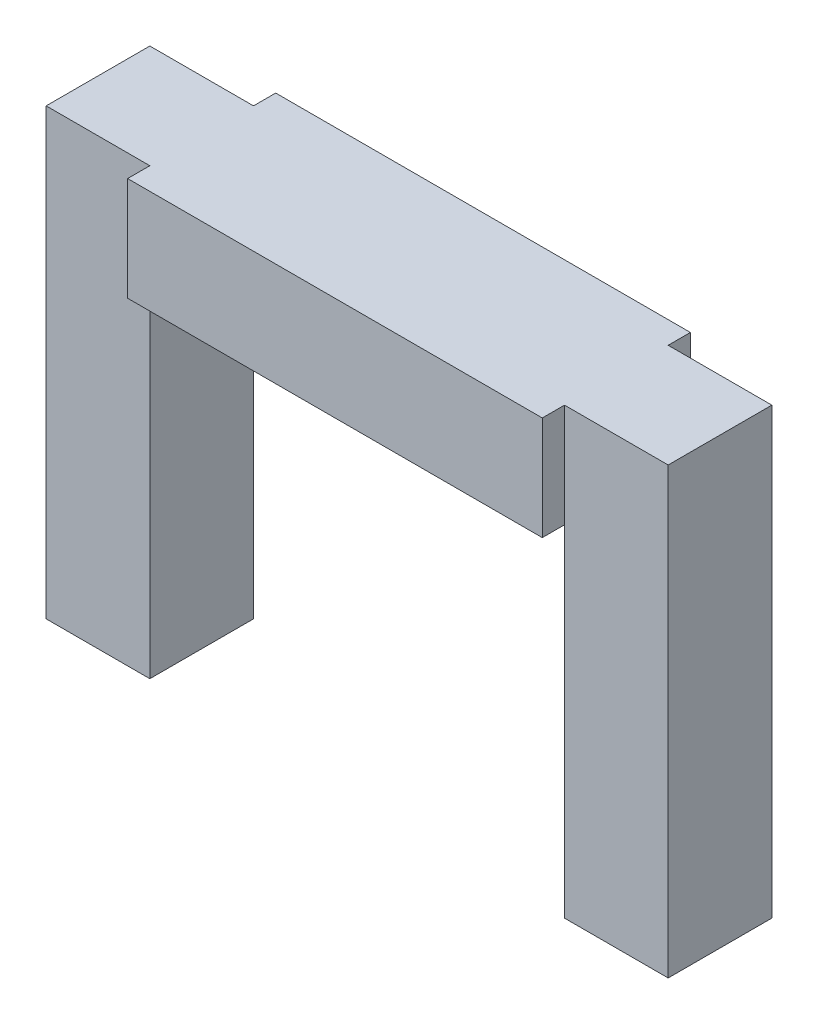
ISO-10303-21;
HEADER;
FILE_DESCRIPTION(('STEP AP214'),'2;1');
FILE_NAME('part.step','',(''),(''),'','','');
FILE_SCHEMA(('AUTOMOTIVE_DESIGN { 1 0 10303 214 1 1 1 1 }'));
ENDSEC;
DATA;
#1=APPLICATION_CONTEXT('core data for automotive mechanical design processes');
#2=APPLICATION_PROTOCOL_DEFINITION('international standard','automotive_design',2000,#1);
#3=PRODUCT_CONTEXT('',#1,'mechanical');
#4=PRODUCT('Part','Part','',(#3));
#5=PRODUCT_RELATED_PRODUCT_CATEGORY('part','',(#4));
#6=PRODUCT_DEFINITION_FORMATION('','',#4);
#7=PRODUCT_DEFINITION_CONTEXT('part definition',#1,'design');
#8=PRODUCT_DEFINITION('design','',#6,#7);
#9=PRODUCT_DEFINITION_SHAPE('','',#8);
#10=(LENGTH_UNIT() NAMED_UNIT(*) SI_UNIT(.MILLI.,.METRE.));
#11=(NAMED_UNIT(*) PLANE_ANGLE_UNIT() SI_UNIT($,.RADIAN.));
#12=(NAMED_UNIT(*) SI_UNIT($,.STERADIAN.) SOLID_ANGLE_UNIT());
#13=UNCERTAINTY_MEASURE_WITH_UNIT(LENGTH_MEASURE(1.E-05),#10,'distance_accuracy_value','');
#14=(GEOMETRIC_REPRESENTATION_CONTEXT(3) GLOBAL_UNCERTAINTY_ASSIGNED_CONTEXT((#13)) GLOBAL_UNIT_ASSIGNED_CONTEXT((#10,
#11,#12)) REPRESENTATION_CONTEXT('',''));
#15=CARTESIAN_POINT('',(0.,0.,0.));
#16=DIRECTION('',(0.,0.,1.));
#17=DIRECTION('',(1.,0.,0.));
#18=AXIS2_PLACEMENT_3D('',#15,#16,#17);
#19=CARTESIAN_POINT('',(4.2,0.,-0.7));
#20=DIRECTION('',(1.,0.,0.));
#21=DIRECTION('',(0.,0.,-1.));
#22=AXIS2_PLACEMENT_3D('',#19,#20,#21);
#23=PLANE('',#22);
#24=DIRECTION('',(0.,0.,-1.));
#25=VECTOR('',#24,1.);
#26=CARTESIAN_POINT('',(4.2,-4.6,0.7));
#27=LINE('',#26,#25);
#28=CARTESIAN_POINT('',(4.2,-4.6,-0.7));
#29=VERTEX_POINT('',#28);
#30=CARTESIAN_POINT('',(4.2,-4.6,0.7));
#31=VERTEX_POINT('',#30);
#32=EDGE_CURVE('E176',#29,#31,#27,.F.);
#33=ORIENTED_EDGE('',*,*,#32,.F.);
#34=DIRECTION('',(0.,1.,0.));
#35=VECTOR('',#34,1.);
#36=CARTESIAN_POINT('',(4.2,0.,-0.7));
#37=LINE('',#36,#35);
#38=CARTESIAN_POINT('',(4.2,1.4,-0.7));
#39=VERTEX_POINT('',#38);
#40=EDGE_CURVE('E147',#29,#39,#37,.T.);
#41=ORIENTED_EDGE('',*,*,#40,.T.);
#42=DIRECTION('',(0.,0.,-1.));
#43=VECTOR('',#42,1.);
#44=CARTESIAN_POINT('',(4.2,1.4,-0.7));
#45=LINE('',#44,#43);
#46=CARTESIAN_POINT('',(4.2,1.4,0.7));
#47=VERTEX_POINT('',#46);
#48=EDGE_CURVE('E20',#39,#47,#45,.F.);
#49=ORIENTED_EDGE('',*,*,#48,.T.);
#50=DIRECTION('',(0.,1.,0.));
#51=VECTOR('',#50,1.);
#52=CARTESIAN_POINT('',(4.2,0.,0.7));
#53=LINE('',#52,#51);
#54=EDGE_CURVE('E181',#31,#47,#53,.T.);
#55=ORIENTED_EDGE('',*,*,#54,.F.);
#56=EDGE_LOOP('',(#33,#41,#49,#55));
#57=FACE_BOUND('',#56,.T.);
#58=ADVANCED_FACE('F17',(#57),#23,.T.);
#59=CARTESIAN_POINT('',(-4.2,1.4,-0.7));
#60=DIRECTION('',(-1.,0.,0.));
#61=DIRECTION('',(0.,0.,1.));
#62=AXIS2_PLACEMENT_3D('',#59,#60,#61);
#63=PLANE('',#62);
#64=DIRECTION('',(0.,0.,-1.));
#65=VECTOR('',#64,1.);
#66=CARTESIAN_POINT('',(-4.2,-4.6,0.7));
#67=LINE('',#66,#65);
#68=CARTESIAN_POINT('',(-4.2,-4.6,0.7));
#69=VERTEX_POINT('',#68);
#70=CARTESIAN_POINT('',(-4.2,-4.6,-0.7));
#71=VERTEX_POINT('',#70);
#72=EDGE_CURVE('E203',#69,#71,#67,.T.);
#73=ORIENTED_EDGE('',*,*,#72,.F.);
#74=DIRECTION('',(0.,1.,0.));
#75=VECTOR('',#74,1.);
#76=CARTESIAN_POINT('',(-4.2,0.,0.7));
#77=LINE('',#76,#75);
#78=CARTESIAN_POINT('',(-4.2,1.4,0.7));
#79=VERTEX_POINT('',#78);
#80=EDGE_CURVE('E195',#79,#69,#77,.F.);
#81=ORIENTED_EDGE('',*,*,#80,.F.);
#82=DIRECTION('',(0.,0.,1.));
#83=VECTOR('',#82,1.);
#84=CARTESIAN_POINT('',(-4.2,1.4,-0.7));
#85=LINE('',#84,#83);
#86=CARTESIAN_POINT('',(-4.2,1.4,-0.7));
#87=VERTEX_POINT('',#86);
#88=EDGE_CURVE('E165',#79,#87,#85,.F.);
#89=ORIENTED_EDGE('',*,*,#88,.T.);
#90=DIRECTION('',(0.,1.,0.));
#91=VECTOR('',#90,1.);
#92=CARTESIAN_POINT('',(-4.2,0.,-0.7));
#93=LINE('',#92,#91);
#94=EDGE_CURVE('E215',#87,#71,#93,.F.);
#95=ORIENTED_EDGE('',*,*,#94,.T.);
#96=EDGE_LOOP('',(#73,#81,#89,#95));
#97=FACE_BOUND('',#96,.T.);
#98=ADVANCED_FACE('F307',(#97),#63,.T.);
#99=CARTESIAN_POINT('',(0.,0.,-0.7));
#100=DIRECTION('',(0.,0.,1.));
#101=DIRECTION('',(1.,0.,0.));
#102=AXIS2_PLACEMENT_3D('',#99,#100,#101);
#103=PLANE('',#102);
#104=ORIENTED_EDGE('',*,*,#40,.F.);
#105=DIRECTION('',(1.,0.,0.));
#106=VECTOR('',#105,1.);
#107=CARTESIAN_POINT('',(2.8,-4.6,-0.7));
#108=LINE('',#107,#106);
#109=CARTESIAN_POINT('',(2.8,-4.6,-0.7));
#110=VERTEX_POINT('',#109);
#111=EDGE_CURVE('E146',#110,#29,#108,.T.);
#112=ORIENTED_EDGE('',*,*,#111,.F.);
#113=DIRECTION('',(0.,1.,0.));
#114=VECTOR('',#113,1.);
#115=CARTESIAN_POINT('',(2.8,1.4,-0.7));
#116=LINE('',#115,#114);
#117=CARTESIAN_POINT('',(2.8,0.,-0.7));
#118=VERTEX_POINT('',#117);
#119=EDGE_CURVE('E162',#118,#110,#116,.F.);
#120=ORIENTED_EDGE('',*,*,#119,.F.);
#121=DIRECTION('',(0.,1.,0.));
#122=VECTOR('',#121,1.);
#123=CARTESIAN_POINT('',(2.8,0.,-0.7));
#124=LINE('',#123,#122);
#125=CARTESIAN_POINT('',(2.8,1.4,-0.7));
#126=VERTEX_POINT('',#125);
#127=EDGE_CURVE('E151',#126,#118,#124,.F.);
#128=ORIENTED_EDGE('',*,*,#127,.F.);
#129=DIRECTION('',(1.,0.,0.));
#130=VECTOR('',#129,1.);
#131=CARTESIAN_POINT('',(0.,1.4,-0.7));
#132=LINE('',#131,#130);
#133=EDGE_CURVE('E137',#39,#126,#132,.F.);
#134=ORIENTED_EDGE('',*,*,#133,.F.);
#135=EDGE_LOOP('',(#104,#112,#120,#128,#134));
#136=FACE_BOUND('',#135,.T.);
#137=ADVANCED_FACE('F160',(#136),#103,.F.);
#138=CARTESIAN_POINT('',(2.8,-4.6,0.7));
#139=DIRECTION('',(0.,-1.,0.));
#140=DIRECTION('',(0.,0.,-1.));
#141=AXIS2_PLACEMENT_3D('',#138,#139,#140);
#142=PLANE('',#141);
#143=ORIENTED_EDGE('',*,*,#32,.T.);
#144=DIRECTION('',(1.,0.,0.));
#145=VECTOR('',#144,1.);
#146=CARTESIAN_POINT('',(0.,-4.6,0.7));
#147=LINE('',#146,#145);
#148=CARTESIAN_POINT('',(2.8,-4.6,0.7));
#149=VERTEX_POINT('',#148);
#150=EDGE_CURVE('E178',#149,#31,#147,.T.);
#151=ORIENTED_EDGE('',*,*,#150,.F.);
#152=DIRECTION('',(0.,0.,1.));
#153=VECTOR('',#152,1.);
#154=CARTESIAN_POINT('',(2.8,-4.6,0.7));
#155=LINE('',#154,#153);
#156=EDGE_CURVE('E222',#110,#149,#155,.T.);
#157=ORIENTED_EDGE('',*,*,#156,.F.);
#158=ORIENTED_EDGE('',*,*,#111,.T.);
#159=EDGE_LOOP('',(#143,#151,#157,#158));
#160=FACE_BOUND('',#159,.T.);
#161=ADVANCED_FACE('F326',(#160),#142,.T.);
#162=CARTESIAN_POINT('',(0.,0.,0.7));
#163=DIRECTION('',(0.,0.,1.));
#164=DIRECTION('',(1.,0.,0.));
#165=AXIS2_PLACEMENT_3D('',#162,#163,#164);
#166=PLANE('',#165);
#167=DIRECTION('',(1.,0.,0.));
#168=VECTOR('',#167,1.);
#169=CARTESIAN_POINT('',(0.,1.4,0.7));
#170=LINE('',#169,#168);
#171=CARTESIAN_POINT('',(2.8,1.4,0.7));
#172=VERTEX_POINT('',#171);
#173=EDGE_CURVE('E184',#47,#172,#170,.F.);
#174=ORIENTED_EDGE('',*,*,#173,.T.);
#175=DIRECTION('',(0.,1.,0.));
#176=VECTOR('',#175,1.);
#177=CARTESIAN_POINT('',(2.8,0.,0.7));
#178=LINE('',#177,#176);
#179=CARTESIAN_POINT('',(2.8,0.,0.7));
#180=VERTEX_POINT('',#179);
#181=EDGE_CURVE('E188',#172,#180,#178,.F.);
#182=ORIENTED_EDGE('',*,*,#181,.T.);
#183=DIRECTION('',(0.,1.,0.));
#184=VECTOR('',#183,1.);
#185=CARTESIAN_POINT('',(2.8,1.4,0.7));
#186=LINE('',#185,#184);
#187=EDGE_CURVE('E225',#149,#180,#186,.T.);
#188=ORIENTED_EDGE('',*,*,#187,.F.);
#189=ORIENTED_EDGE('',*,*,#150,.T.);
#190=ORIENTED_EDGE('',*,*,#54,.T.);
#191=EDGE_LOOP('',(#174,#182,#188,#189,#190));
#192=FACE_BOUND('',#191,.T.);
#193=ADVANCED_FACE('F319',(#192),#166,.T.);
#194=CARTESIAN_POINT('',(0.,0.,0.7));
#195=DIRECTION('',(0.,0.,1.));
#196=DIRECTION('',(1.,0.,0.));
#197=AXIS2_PLACEMENT_3D('',#194,#195,#196);
#198=PLANE('',#197);
#199=DIRECTION('',(0.,1.,0.));
#200=VECTOR('',#199,1.);
#201=CARTESIAN_POINT('',(-2.8,-4.6,0.7));
#202=LINE('',#201,#200);
#203=CARTESIAN_POINT('',(-2.8,0.,0.7));
#204=VERTEX_POINT('',#203);
#205=CARTESIAN_POINT('',(-2.8,-4.6,0.7));
#206=VERTEX_POINT('',#205);
#207=EDGE_CURVE('E229',#204,#206,#202,.F.);
#208=ORIENTED_EDGE('',*,*,#207,.F.);
#209=DIRECTION('',(0.,1.,0.));
#210=VECTOR('',#209,1.);
#211=CARTESIAN_POINT('',(-2.8,0.,0.7));
#212=LINE('',#211,#210);
#213=CARTESIAN_POINT('',(-2.8,1.4,0.7));
#214=VERTEX_POINT('',#213);
#215=EDGE_CURVE('E199',#204,#214,#212,.T.);
#216=ORIENTED_EDGE('',*,*,#215,.T.);
#217=DIRECTION('',(1.,0.,0.));
#218=VECTOR('',#217,1.);
#219=CARTESIAN_POINT('',(0.,1.4,0.7));
#220=LINE('',#219,#218);
#221=EDGE_CURVE('E191',#214,#79,#220,.F.);
#222=ORIENTED_EDGE('',*,*,#221,.T.);
#223=ORIENTED_EDGE('',*,*,#80,.T.);
#224=DIRECTION('',(1.,0.,0.));
#225=VECTOR('',#224,1.);
#226=CARTESIAN_POINT('',(-4.2,-4.6,0.7));
#227=LINE('',#226,#225);
#228=EDGE_CURVE('E206',#206,#69,#227,.F.);
#229=ORIENTED_EDGE('',*,*,#228,.F.);
#230=EDGE_LOOP('',(#208,#216,#222,#223,#229));
#231=FACE_BOUND('',#230,.T.);
#232=ADVANCED_FACE('F310',(#231),#198,.T.);
#233=CARTESIAN_POINT('',(-4.2,-4.6,0.7));
#234=DIRECTION('',(0.,-1.,0.));
#235=DIRECTION('',(0.,0.,-1.));
#236=AXIS2_PLACEMENT_3D('',#233,#234,#235);
#237=PLANE('',#236);
#238=DIRECTION('',(0.,0.,-1.));
#239=VECTOR('',#238,1.);
#240=CARTESIAN_POINT('',(-2.8,-4.6,0.7));
#241=LINE('',#240,#239);
#242=CARTESIAN_POINT('',(-2.8,-4.6,-0.7));
#243=VERTEX_POINT('',#242);
#244=EDGE_CURVE('E233',#206,#243,#241,.T.);
#245=ORIENTED_EDGE('',*,*,#244,.F.);
#246=ORIENTED_EDGE('',*,*,#228,.T.);
#247=ORIENTED_EDGE('',*,*,#72,.T.);
#248=DIRECTION('',(1.,0.,0.));
#249=VECTOR('',#248,1.);
#250=CARTESIAN_POINT('',(0.,-4.6,-0.7));
#251=LINE('',#250,#249);
#252=EDGE_CURVE('E218',#71,#243,#251,.T.);
#253=ORIENTED_EDGE('',*,*,#252,.T.);
#254=EDGE_LOOP('',(#245,#246,#247,#253));
#255=FACE_BOUND('',#254,.T.);
#256=ADVANCED_FACE('F337',(#255),#237,.T.);
#257=CARTESIAN_POINT('',(0.,0.,-0.7));
#258=DIRECTION('',(0.,0.,1.));
#259=DIRECTION('',(1.,0.,0.));
#260=AXIS2_PLACEMENT_3D('',#257,#258,#259);
#261=PLANE('',#260);
#262=ORIENTED_EDGE('',*,*,#252,.F.);
#263=ORIENTED_EDGE('',*,*,#94,.F.);
#264=DIRECTION('',(1.,0.,0.));
#265=VECTOR('',#264,1.);
#266=CARTESIAN_POINT('',(0.,1.4,-0.7));
#267=LINE('',#266,#265);
#268=CARTESIAN_POINT('',(-2.8,1.4,-0.7));
#269=VERTEX_POINT('',#268);
#270=EDGE_CURVE('E212',#269,#87,#267,.F.);
#271=ORIENTED_EDGE('',*,*,#270,.F.);
#272=DIRECTION('',(0.,1.,0.));
#273=VECTOR('',#272,1.);
#274=CARTESIAN_POINT('',(-2.8,0.,-0.7));
#275=LINE('',#274,#273);
#276=CARTESIAN_POINT('',(-2.8,0.,-0.7));
#277=VERTEX_POINT('',#276);
#278=EDGE_CURVE('E209',#277,#269,#275,.T.);
#279=ORIENTED_EDGE('',*,*,#278,.F.);
#280=DIRECTION('',(0.,1.,0.));
#281=VECTOR('',#280,1.);
#282=CARTESIAN_POINT('',(-2.8,-4.6,-0.7));
#283=LINE('',#282,#281);
#284=EDGE_CURVE('E158',#243,#277,#283,.T.);
#285=ORIENTED_EDGE('',*,*,#284,.F.);
#286=EDGE_LOOP('',(#262,#263,#271,#279,#285));
#287=FACE_BOUND('',#286,.T.);
#288=ADVANCED_FACE('F303',(#287),#261,.F.);
#289=CARTESIAN_POINT('',(2.8,1.4,0.7));
#290=DIRECTION('',(-1.,0.,0.));
#291=DIRECTION('',(0.,0.,1.));
#292=AXIS2_PLACEMENT_3D('',#289,#290,#291);
#293=PLANE('',#292);
#294=ORIENTED_EDGE('',*,*,#187,.T.);
#295=DIRECTION('',(0.,0.,-1.));
#296=VECTOR('',#295,1.);
#297=CARTESIAN_POINT('',(2.8,0.,-0.7));
#298=LINE('',#297,#296);
#299=EDGE_CURVE('E254',#118,#180,#298,.F.);
#300=ORIENTED_EDGE('',*,*,#299,.F.);
#301=ORIENTED_EDGE('',*,*,#119,.T.);
#302=ORIENTED_EDGE('',*,*,#156,.T.);
#303=EDGE_LOOP('',(#294,#300,#301,#302));
#304=FACE_BOUND('',#303,.T.);
#305=ADVANCED_FACE('F328',(#304),#293,.T.);
#306=CARTESIAN_POINT('',(-2.8,-4.6,0.7));
#307=DIRECTION('',(1.,0.,0.));
#308=DIRECTION('',(0.,0.,-1.));
#309=AXIS2_PLACEMENT_3D('',#306,#307,#308);
#310=PLANE('',#309);
#311=ORIENTED_EDGE('',*,*,#284,.T.);
#312=DIRECTION('',(0.,0.,-1.));
#313=VECTOR('',#312,1.);
#314=CARTESIAN_POINT('',(-2.8,0.,-0.7));
#315=LINE('',#314,#313);
#316=EDGE_CURVE('E266',#204,#277,#315,.T.);
#317=ORIENTED_EDGE('',*,*,#316,.F.);
#318=ORIENTED_EDGE('',*,*,#207,.T.);
#319=ORIENTED_EDGE('',*,*,#244,.T.);
#320=EDGE_LOOP('',(#311,#317,#318,#319));
#321=FACE_BOUND('',#320,.T.);
#322=ADVANCED_FACE('F334',(#321),#310,.T.);
#323=CARTESIAN_POINT('',(2.8,0.,1.));
#324=DIRECTION('',(1.,0.,0.));
#325=DIRECTION('',(0.,0.,-1.));
#326=AXIS2_PLACEMENT_3D('',#323,#324,#325);
#327=PLANE('',#326);
#328=DIRECTION('',(0.,0.,-1.));
#329=VECTOR('',#328,1.);
#330=CARTESIAN_POINT('',(2.8,1.4,1.));
#331=LINE('',#330,#329);
#332=CARTESIAN_POINT('',(2.8,1.4,-1.));
#333=VERTEX_POINT('',#332);
#334=EDGE_CURVE('E141',#333,#126,#331,.F.);
#335=ORIENTED_EDGE('',*,*,#334,.T.);
#336=ORIENTED_EDGE('',*,*,#127,.T.);
#337=DIRECTION('',(0.,0.,-1.));
#338=VECTOR('',#337,1.);
#339=CARTESIAN_POINT('',(2.8,0.,-0.7));
#340=LINE('',#339,#338);
#341=CARTESIAN_POINT('',(2.8,0.,-1.));
#342=VERTEX_POINT('',#341);
#343=EDGE_CURVE('E250',#342,#118,#340,.F.);
#344=ORIENTED_EDGE('',*,*,#343,.F.);
#345=DIRECTION('',(0.,1.,0.));
#346=VECTOR('',#345,1.);
#347=CARTESIAN_POINT('',(2.8,0.,-1.));
#348=LINE('',#347,#346);
#349=EDGE_CURVE('E154',#342,#333,#348,.T.);
#350=ORIENTED_EDGE('',*,*,#349,.T.);
#351=EDGE_LOOP('',(#335,#336,#344,#350));
#352=FACE_BOUND('',#351,.T.);
#353=ADVANCED_FACE('F150',(#352),#327,.T.);
#354=CARTESIAN_POINT('',(-2.8,1.4,1.));
#355=DIRECTION('',(-1.,0.,0.));
#356=DIRECTION('',(0.,0.,1.));
#357=AXIS2_PLACEMENT_3D('',#354,#355,#356);
#358=PLANE('',#357);
#359=DIRECTION('',(0.,0.,-1.));
#360=VECTOR('',#359,1.);
#361=CARTESIAN_POINT('',(-2.8,0.,-0.7));
#362=LINE('',#361,#360);
#363=CARTESIAN_POINT('',(-2.8,0.,-1.));
#364=VERTEX_POINT('',#363);
#365=EDGE_CURVE('E247',#277,#364,#362,.T.);
#366=ORIENTED_EDGE('',*,*,#365,.F.);
#367=ORIENTED_EDGE('',*,*,#278,.T.);
#368=DIRECTION('',(0.,0.,1.));
#369=VECTOR('',#368,1.);
#370=CARTESIAN_POINT('',(-2.8,1.4,1.));
#371=LINE('',#370,#369);
#372=CARTESIAN_POINT('',(-2.8,1.4,-1.));
#373=VERTEX_POINT('',#372);
#374=EDGE_CURVE('E157',#269,#373,#371,.F.);
#375=ORIENTED_EDGE('',*,*,#374,.T.);
#376=DIRECTION('',(0.,1.,0.));
#377=VECTOR('',#376,1.);
#378=CARTESIAN_POINT('',(-2.8,0.,-1.));
#379=LINE('',#378,#377);
#380=EDGE_CURVE('E275',#373,#364,#379,.F.);
#381=ORIENTED_EDGE('',*,*,#380,.T.);
#382=EDGE_LOOP('',(#366,#367,#375,#381));
#383=FACE_BOUND('',#382,.T.);
#384=ADVANCED_FACE('F299',(#383),#358,.T.);
#385=CARTESIAN_POINT('',(2.8,0.,1.));
#386=DIRECTION('',(1.,0.,0.));
#387=DIRECTION('',(0.,0.,-1.));
#388=AXIS2_PLACEMENT_3D('',#385,#386,#387);
#389=PLANE('',#388);
#390=DIRECTION('',(0.,0.,-1.));
#391=VECTOR('',#390,1.);
#392=CARTESIAN_POINT('',(2.8,0.,-0.7));
#393=LINE('',#392,#391);
#394=CARTESIAN_POINT('',(2.8,0.,1.));
#395=VERTEX_POINT('',#394);
#396=EDGE_CURVE('E258',#180,#395,#393,.F.);
#397=ORIENTED_EDGE('',*,*,#396,.F.);
#398=ORIENTED_EDGE('',*,*,#181,.F.);
#399=DIRECTION('',(0.,0.,-1.));
#400=VECTOR('',#399,1.);
#401=CARTESIAN_POINT('',(2.8,1.4,1.));
#402=LINE('',#401,#400);
#403=CARTESIAN_POINT('',(2.8,1.4,1.));
#404=VERTEX_POINT('',#403);
#405=EDGE_CURVE('E40',#172,#404,#402,.F.);
#406=ORIENTED_EDGE('',*,*,#405,.T.);
#407=DIRECTION('',(0.,1.,0.));
#408=VECTOR('',#407,1.);
#409=CARTESIAN_POINT('',(2.8,0.,1.));
#410=LINE('',#409,#408);
#411=EDGE_CURVE('E279',#395,#404,#410,.T.);
#412=ORIENTED_EDGE('',*,*,#411,.F.);
#413=EDGE_LOOP('',(#397,#398,#406,#412));
#414=FACE_BOUND('',#413,.T.);
#415=ADVANCED_FACE('F360',(#414),#389,.T.);
#416=CARTESIAN_POINT('',(-2.8,1.4,1.));
#417=DIRECTION('',(-1.,0.,0.));
#418=DIRECTION('',(0.,0.,1.));
#419=AXIS2_PLACEMENT_3D('',#416,#417,#418);
#420=PLANE('',#419);
#421=DIRECTION('',(0.,0.,1.));
#422=VECTOR('',#421,1.);
#423=CARTESIAN_POINT('',(-2.8,1.4,1.));
#424=LINE('',#423,#422);
#425=CARTESIAN_POINT('',(-2.8,1.4,1.));
#426=VERTEX_POINT('',#425);
#427=EDGE_CURVE('E243',#426,#214,#424,.F.);
#428=ORIENTED_EDGE('',*,*,#427,.T.);
#429=ORIENTED_EDGE('',*,*,#215,.F.);
#430=DIRECTION('',(0.,0.,-1.));
#431=VECTOR('',#430,1.);
#432=CARTESIAN_POINT('',(-2.8,0.,-0.7));
#433=LINE('',#432,#431);
#434=CARTESIAN_POINT('',(-2.8,0.,1.));
#435=VERTEX_POINT('',#434);
#436=EDGE_CURVE('E262',#435,#204,#433,.T.);
#437=ORIENTED_EDGE('',*,*,#436,.F.);
#438=DIRECTION('',(0.,1.,0.));
#439=VECTOR('',#438,1.);
#440=CARTESIAN_POINT('',(-2.8,0.,1.));
#441=LINE('',#440,#439);
#442=EDGE_CURVE('E282',#426,#435,#441,.F.);
#443=ORIENTED_EDGE('',*,*,#442,.F.);
#444=EDGE_LOOP('',(#428,#429,#437,#443));
#445=FACE_BOUND('',#444,.T.);
#446=ADVANCED_FACE('F313',(#445),#420,.T.);
#447=CARTESIAN_POINT('',(-4.2,0.,-0.7));
#448=DIRECTION('',(0.,-1.,0.));
#449=DIRECTION('',(0.,0.,-1.));
#450=AXIS2_PLACEMENT_3D('',#447,#448,#449);
#451=PLANE('',#450);
#452=ORIENTED_EDGE('',*,*,#436,.T.);
#453=ORIENTED_EDGE('',*,*,#316,.T.);
#454=ORIENTED_EDGE('',*,*,#365,.T.);
#455=DIRECTION('',(1.,0.,0.));
#456=VECTOR('',#455,1.);
#457=CARTESIAN_POINT('',(0.,0.,-1.));
#458=LINE('',#457,#456);
#459=EDGE_CURVE('E270',#364,#342,#458,.T.);
#460=ORIENTED_EDGE('',*,*,#459,.T.);
#461=ORIENTED_EDGE('',*,*,#343,.T.);
#462=ORIENTED_EDGE('',*,*,#299,.T.);
#463=ORIENTED_EDGE('',*,*,#396,.T.);
#464=DIRECTION('',(1.,0.,0.));
#465=VECTOR('',#464,1.);
#466=CARTESIAN_POINT('',(0.,0.,1.));
#467=LINE('',#466,#465);
#468=EDGE_CURVE('E286',#435,#395,#467,.T.);
#469=ORIENTED_EDGE('',*,*,#468,.F.);
#470=EDGE_LOOP('',(#452,#453,#454,#460,#461,#462,#463,#469));
#471=FACE_BOUND('',#470,.T.);
#472=ADVANCED_FACE('F331',(#471),#451,.T.);
#473=CARTESIAN_POINT('',(0.,0.,-1.));
#474=DIRECTION('',(0.,0.,1.));
#475=DIRECTION('',(1.,0.,0.));
#476=AXIS2_PLACEMENT_3D('',#473,#474,#475);
#477=PLANE('',#476);
#478=DIRECTION('',(1.,0.,0.));
#479=VECTOR('',#478,1.);
#480=CARTESIAN_POINT('',(4.2,1.4,-1.));
#481=LINE('',#480,#479);
#482=EDGE_CURVE('E27',#333,#373,#481,.F.);
#483=ORIENTED_EDGE('',*,*,#482,.F.);
#484=ORIENTED_EDGE('',*,*,#349,.F.);
#485=ORIENTED_EDGE('',*,*,#459,.F.);
#486=ORIENTED_EDGE('',*,*,#380,.F.);
#487=EDGE_LOOP('',(#483,#484,#485,#486));
#488=FACE_BOUND('',#487,.T.);
#489=ADVANCED_FACE('F295',(#488),#477,.F.);
#490=CARTESIAN_POINT('',(0.,0.,1.));
#491=DIRECTION('',(0.,0.,1.));
#492=DIRECTION('',(1.,0.,0.));
#493=AXIS2_PLACEMENT_3D('',#490,#491,#492);
#494=PLANE('',#493);
#495=ORIENTED_EDGE('',*,*,#442,.T.);
#496=ORIENTED_EDGE('',*,*,#468,.T.);
#497=ORIENTED_EDGE('',*,*,#411,.T.);
#498=DIRECTION('',(1.,0.,0.));
#499=VECTOR('',#498,1.);
#500=CARTESIAN_POINT('',(4.2,1.4,1.));
#501=LINE('',#500,#499);
#502=EDGE_CURVE('E11',#426,#404,#501,.T.);
#503=ORIENTED_EDGE('',*,*,#502,.F.);
#504=EDGE_LOOP('',(#495,#496,#497,#503));
#505=FACE_BOUND('',#504,.T.);
#506=ADVANCED_FACE('F317',(#505),#494,.T.);
#507=CARTESIAN_POINT('',(4.2,1.4,-0.7));
#508=DIRECTION('',(0.,1.,0.));
#509=DIRECTION('',(0.,0.,1.));
#510=AXIS2_PLACEMENT_3D('',#507,#508,#509);
#511=PLANE('',#510);
#512=ORIENTED_EDGE('',*,*,#405,.F.);
#513=ORIENTED_EDGE('',*,*,#173,.F.);
#514=ORIENTED_EDGE('',*,*,#48,.F.);
#515=ORIENTED_EDGE('',*,*,#133,.T.);
#516=ORIENTED_EDGE('',*,*,#334,.F.);
#517=ORIENTED_EDGE('',*,*,#482,.T.);
#518=ORIENTED_EDGE('',*,*,#374,.F.);
#519=ORIENTED_EDGE('',*,*,#270,.T.);
#520=ORIENTED_EDGE('',*,*,#88,.F.);
#521=ORIENTED_EDGE('',*,*,#221,.F.);
#522=ORIENTED_EDGE('',*,*,#427,.F.);
#523=ORIENTED_EDGE('',*,*,#502,.T.);
#524=EDGE_LOOP('',(#512,#513,#514,#515,#516,#517,#518,#519,#520,#521,#522,#523));
#525=FACE_BOUND('',#524,.T.);
#526=ADVANCED_FACE('F139',(#525),#511,.T.);
#527=CLOSED_SHELL('',(#58,#98,#137,#161,#193,#232,#256,#288,#305,#322,#353,#384,#415,#446,#472,
#489,#506,#526));
#528=MANIFOLD_SOLID_BREP('B1',#527);
#529=ADVANCED_BREP_SHAPE_REPRESENTATION('',(#18,#528),#14);
#530=SHAPE_DEFINITION_REPRESENTATION(#9,#529);
ENDSEC;
END-ISO-10303-21;
